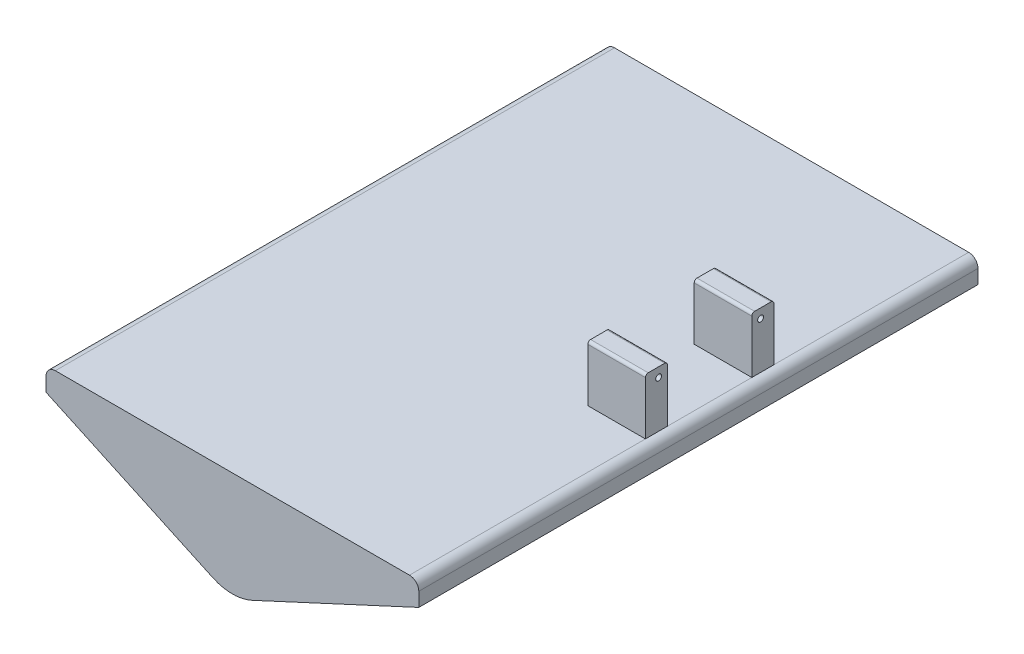
ISO-10303-21;
HEADER;
FILE_DESCRIPTION(('STEP AP214'),'2;1');
FILE_NAME('part.step','',(''),(''),'','','');
FILE_SCHEMA(('AUTOMOTIVE_DESIGN { 1 0 10303 214 1 1 1 1 }'));
ENDSEC;
DATA;
#1=APPLICATION_CONTEXT('core data for automotive mechanical design processes');
#2=APPLICATION_PROTOCOL_DEFINITION('international standard','automotive_design',2000,#1);
#3=PRODUCT_CONTEXT('',#1,'mechanical');
#4=PRODUCT('Part','Part','',(#3));
#5=PRODUCT_RELATED_PRODUCT_CATEGORY('part','',(#4));
#6=PRODUCT_DEFINITION_FORMATION('','',#4);
#7=PRODUCT_DEFINITION_CONTEXT('part definition',#1,'design');
#8=PRODUCT_DEFINITION('design','',#6,#7);
#9=PRODUCT_DEFINITION_SHAPE('','',#8);
#10=(LENGTH_UNIT() NAMED_UNIT(*) SI_UNIT(.MILLI.,.METRE.));
#11=(NAMED_UNIT(*) PLANE_ANGLE_UNIT() SI_UNIT($,.RADIAN.));
#12=(NAMED_UNIT(*) SI_UNIT($,.STERADIAN.) SOLID_ANGLE_UNIT());
#13=UNCERTAINTY_MEASURE_WITH_UNIT(LENGTH_MEASURE(1.E-05),#10,'distance_accuracy_value','');
#14=(GEOMETRIC_REPRESENTATION_CONTEXT(3) GLOBAL_UNCERTAINTY_ASSIGNED_CONTEXT((#13)) GLOBAL_UNIT_ASSIGNED_CONTEXT((#10,
#11,#12)) REPRESENTATION_CONTEXT('',''));
#15=CARTESIAN_POINT('',(0.,0.,0.));
#16=DIRECTION('',(0.,0.,1.));
#17=DIRECTION('',(1.,0.,0.));
#18=AXIS2_PLACEMENT_3D('',#15,#16,#17);
#19=CARTESIAN_POINT('',(0.,3.175,152.4));
#20=DIRECTION('',(0.,1.,0.));
#21=DIRECTION('',(0.,0.,1.));
#22=AXIS2_PLACEMENT_3D('',#19,#20,#21);
#23=PLANE('',#22);
#24=DIRECTION('',(0.,0.,1.));
#25=VECTOR('',#24,1.);
#26=CARTESIAN_POINT('',(32.5600000000001,3.175,53.1));
#27=LINE('',#26,#25);
#28=CARTESIAN_POINT('',(32.5600000000001,3.175,53.1));
#29=VERTEX_POINT('',#28);
#30=CARTESIAN_POINT('',(32.5600000000001,3.175,59.1));
#31=VERTEX_POINT('',#30);
#32=EDGE_CURVE('E233',#29,#31,#27,.T.);
#33=ORIENTED_EDGE('',*,*,#32,.F.);
#34=DIRECTION('',(-1.,0.,0.));
#35=VECTOR('',#34,1.);
#36=CARTESIAN_POINT('',(48.2600000000001,3.175,53.1));
#37=LINE('',#36,#35);
#38=CARTESIAN_POINT('',(48.2600000000001,3.175,53.1));
#39=VERTEX_POINT('',#38);
#40=EDGE_CURVE('E206',#39,#29,#37,.T.);
#41=ORIENTED_EDGE('',*,*,#40,.F.);
#42=DIRECTION('',(0.,0.,-1.));
#43=VECTOR('',#42,1.);
#44=CARTESIAN_POINT('',(48.2600000000001,3.175,152.4));
#45=LINE('',#44,#43);
#46=CARTESIAN_POINT('',(48.2600000000001,3.175,0.));
#47=VERTEX_POINT('',#46);
#48=EDGE_CURVE('E215',#39,#47,#45,.T.);
#49=ORIENTED_EDGE('',*,*,#48,.T.);
#50=DIRECTION('',(1.,0.,0.));
#51=VECTOR('',#50,1.);
#52=CARTESIAN_POINT('',(0.,3.175,0.));
#53=LINE('',#52,#51);
#54=CARTESIAN_POINT('',(-48.2599999999999,3.175,0.));
#55=VERTEX_POINT('',#54);
#56=EDGE_CURVE('E337',#55,#47,#53,.T.);
#57=ORIENTED_EDGE('',*,*,#56,.F.);
#58=DIRECTION('',(0.,0.,-1.));
#59=VECTOR('',#58,1.);
#60=CARTESIAN_POINT('',(-48.2599999999999,3.175,152.4));
#61=LINE('',#60,#59);
#62=CARTESIAN_POINT('',(-48.2599999999999,3.175,152.4));
#63=VERTEX_POINT('',#62);
#64=EDGE_CURVE('E365',#55,#63,#61,.F.);
#65=ORIENTED_EDGE('',*,*,#64,.T.);
#66=DIRECTION('',(1.,0.,0.));
#67=VECTOR('',#66,1.);
#68=CARTESIAN_POINT('',(0.,3.175,152.4));
#69=LINE('',#68,#67);
#70=CARTESIAN_POINT('',(48.2600000000001,3.175,152.4));
#71=VERTEX_POINT('',#70);
#72=EDGE_CURVE('E321',#63,#71,#69,.T.);
#73=ORIENTED_EDGE('',*,*,#72,.T.);
#74=CARTESIAN_POINT('',(48.2600000000001,3.175,88.1));
#75=VERTEX_POINT('',#74);
#76=EDGE_CURVE('E229',#71,#75,#45,.T.);
#77=ORIENTED_EDGE('',*,*,#76,.T.);
#78=DIRECTION('',(1.,0.,0.));
#79=VECTOR('',#78,1.);
#80=CARTESIAN_POINT('',(48.2600000000001,3.175,88.1));
#81=LINE('',#80,#79);
#82=CARTESIAN_POINT('',(32.5600000000001,3.175,88.1));
#83=VERTEX_POINT('',#82);
#84=EDGE_CURVE('E255',#83,#75,#81,.T.);
#85=ORIENTED_EDGE('',*,*,#84,.F.);
#86=DIRECTION('',(0.,0.,1.));
#87=VECTOR('',#86,1.);
#88=CARTESIAN_POINT('',(32.5600000000001,3.175,82.1));
#89=LINE('',#88,#87);
#90=CARTESIAN_POINT('',(32.5600000000001,3.175,82.1));
#91=VERTEX_POINT('',#90);
#92=EDGE_CURVE('E261',#91,#83,#89,.T.);
#93=ORIENTED_EDGE('',*,*,#92,.F.);
#94=DIRECTION('',(-1.,0.,0.));
#95=VECTOR('',#94,1.);
#96=CARTESIAN_POINT('',(48.2600000000001,3.175,82.1));
#97=LINE('',#96,#95);
#98=CARTESIAN_POINT('',(48.2600000000001,3.175,82.1));
#99=VERTEX_POINT('',#98);
#100=EDGE_CURVE('E240',#99,#91,#97,.T.);
#101=ORIENTED_EDGE('',*,*,#100,.F.);
#102=CARTESIAN_POINT('',(48.2600000000001,3.175,59.1));
#103=VERTEX_POINT('',#102);
#104=EDGE_CURVE('E226',#99,#103,#45,.T.);
#105=ORIENTED_EDGE('',*,*,#104,.T.);
#106=DIRECTION('',(1.,0.,0.));
#107=VECTOR('',#106,1.);
#108=CARTESIAN_POINT('',(48.2600000000001,3.175,59.1));
#109=LINE('',#108,#107);
#110=EDGE_CURVE('E250',#31,#103,#109,.T.);
#111=ORIENTED_EDGE('',*,*,#110,.F.);
#112=EDGE_LOOP('',(#33,#41,#49,#57,#65,#73,#77,#85,#93,#101,#105,#111));
#113=FACE_BOUND('',#112,.T.);
#114=ADVANCED_FACE('F43',(#113),#23,.T.);
#115=CARTESIAN_POINT('',(-10.1779518832667,-21.9828280773283,152.4));
#116=DIRECTION('',(0.420147930242184,0.907455627958309,0.));
#117=DIRECTION('',(-0.907455627958309,0.420147930242184,0.));
#118=AXIS2_PLACEMENT_3D('',#115,#116,#117);
#119=PLANE('',#118);
#120=DIRECTION('',(0.,0.,-1.));
#121=VECTOR('',#120,1.);
#122=CARTESIAN_POINT('',(-5.33587871407572,-24.2246864750705,152.4));
#123=LINE('',#122,#121);
#124=CARTESIAN_POINT('',(-5.33587871407572,-24.2246864750705,57.15));
#125=VERTEX_POINT('',#124);
#126=CARTESIAN_POINT('',(-5.33587871407572,-24.2246864750705,0.));
#127=VERTEX_POINT('',#126);
#128=EDGE_CURVE('E351',#125,#127,#123,.T.);
#129=ORIENTED_EDGE('',*,*,#128,.F.);
#130=DIRECTION('',(-0.907455627958309,0.420147930242184,0.));
#131=VECTOR('',#130,1.);
#132=CARTESIAN_POINT('',(-10.1779518832667,-21.9828280773283,57.15));
#133=LINE('',#132,#131);
#134=CARTESIAN_POINT('',(-50.7999999999999,-3.175,57.15));
#135=VERTEX_POINT('',#134);
#136=EDGE_CURVE('E300',#125,#135,#133,.T.);
#137=ORIENTED_EDGE('',*,*,#136,.T.);
#138=DIRECTION('',(0.,0.,-1.));
#139=VECTOR('',#138,1.);
#140=CARTESIAN_POINT('',(-50.7999999999999,-3.17499999999999,152.4));
#141=LINE('',#140,#139);
#142=CARTESIAN_POINT('',(-50.7999999999999,-3.17499999999999,0.));
#143=VERTEX_POINT('',#142);
#144=EDGE_CURVE('E326',#135,#143,#141,.T.);
#145=ORIENTED_EDGE('',*,*,#144,.T.);
#146=DIRECTION('',(0.907455627958309,-0.420147930242184,0.));
#147=VECTOR('',#146,1.);
#148=CARTESIAN_POINT('',(-10.1779518832667,-21.9828280773283,0.));
#149=LINE('',#148,#147);
#150=EDGE_CURVE('E307',#143,#127,#149,.T.);
#151=ORIENTED_EDGE('',*,*,#150,.T.);
#152=EDGE_LOOP('',(#129,#137,#145,#151));
#153=FACE_BOUND('',#152,.T.);
#154=ADVANCED_FACE('F467',(#153),#119,.F.);
#155=CARTESIAN_POINT('',(0.,-12.7,152.4));
#156=DIRECTION('',(0.,0.,-1.));
#157=DIRECTION('',(-1.,0.,0.));
#158=AXIS2_PLACEMENT_3D('',#155,#156,#157);
#159=CYLINDRICAL_SURFACE('',#158,12.7);
#160=CARTESIAN_POINT('',(-5.33587871407572,-24.2246864750705,152.4));
#161=VERTEX_POINT('',#160);
#162=CARTESIAN_POINT('',(-5.33587871407572,-24.2246864750705,95.25));
#163=VERTEX_POINT('',#162);
#164=EDGE_CURVE('E352',#161,#163,#123,.T.);
#165=ORIENTED_EDGE('',*,*,#164,.T.);
#166=CARTESIAN_POINT('',(0.,-12.7,95.25));
#167=DIRECTION('',(0.,0.,1.));
#168=DIRECTION('',(1.,0.,0.));
#169=AXIS2_PLACEMENT_3D('',#166,#167,#168);
#170=CIRCLE('',#169,12.7);
#171=CARTESIAN_POINT('',(5.33587871407572,-24.2246864750705,95.25));
#172=VERTEX_POINT('',#171);
#173=EDGE_CURVE('E289',#163,#172,#170,.T.);
#174=ORIENTED_EDGE('',*,*,#173,.T.);
#175=DIRECTION('',(0.,0.,-1.));
#176=VECTOR('',#175,1.);
#177=CARTESIAN_POINT('',(5.33587871407572,-24.2246864750705,152.4));
#178=LINE('',#177,#176);
#179=CARTESIAN_POINT('',(5.33587871407572,-24.2246864750705,152.4));
#180=VERTEX_POINT('',#179);
#181=EDGE_CURVE('E348',#180,#172,#178,.T.);
#182=ORIENTED_EDGE('',*,*,#181,.F.);
#183=CARTESIAN_POINT('',(0.,-12.7,152.4));
#184=DIRECTION('',(0.,0.,1.));
#185=DIRECTION('',(1.,0.,0.));
#186=AXIS2_PLACEMENT_3D('',#183,#184,#185);
#187=CIRCLE('',#186,12.7);
#188=EDGE_CURVE('E313',#161,#180,#187,.T.);
#189=ORIENTED_EDGE('',*,*,#188,.F.);
#190=EDGE_LOOP('',(#165,#174,#182,#189));
#191=FACE_BOUND('',#190,.T.);
#192=ADVANCED_FACE('F474',(#191),#159,.T.);
#193=CARTESIAN_POINT('',(10.1779518832667,-21.9828280773283,152.4));
#194=DIRECTION('',(0.420147930242182,-0.90745562795831,0.));
#195=DIRECTION('',(0.90745562795831,0.420147930242183,0.));
#196=AXIS2_PLACEMENT_3D('',#193,#194,#195);
#197=PLANE('',#196);
#198=DIRECTION('',(0.90745562795831,0.420147930242183,0.));
#199=VECTOR('',#198,1.);
#200=CARTESIAN_POINT('',(10.1779518832667,-21.9828280773283,57.15));
#201=LINE('',#200,#199);
#202=CARTESIAN_POINT('',(5.33587871407572,-24.2246864750705,57.15));
#203=VERTEX_POINT('',#202);
#204=CARTESIAN_POINT('',(50.7999999999999,-3.175,57.15));
#205=VERTEX_POINT('',#204);
#206=EDGE_CURVE('E295',#203,#205,#201,.T.);
#207=ORIENTED_EDGE('',*,*,#206,.F.);
#208=CARTESIAN_POINT('',(5.33587871407572,-24.2246864750705,0.));
#209=VERTEX_POINT('',#208);
#210=EDGE_CURVE('E347',#203,#209,#178,.T.);
#211=ORIENTED_EDGE('',*,*,#210,.T.);
#212=DIRECTION('',(-0.90745562795831,-0.420147930242182,0.));
#213=VECTOR('',#212,1.);
#214=CARTESIAN_POINT('',(10.1779518832667,-21.9828280773283,0.));
#215=LINE('',#214,#213);
#216=CARTESIAN_POINT('',(50.8000000000001,-3.175,0.));
#217=VERTEX_POINT('',#216);
#218=EDGE_CURVE('E332',#217,#209,#215,.T.);
#219=ORIENTED_EDGE('',*,*,#218,.F.);
#220=DIRECTION('',(0.,0.,-1.));
#221=VECTOR('',#220,1.);
#222=CARTESIAN_POINT('',(50.8000000000001,-3.175,152.4));
#223=LINE('',#222,#221);
#224=EDGE_CURVE('E343',#205,#217,#223,.T.);
#225=ORIENTED_EDGE('',*,*,#224,.F.);
#226=EDGE_LOOP('',(#207,#211,#219,#225));
#227=FACE_BOUND('',#226,.T.);
#228=ADVANCED_FACE('F491',(#227),#197,.T.);
#229=CARTESIAN_POINT('',(0.,-12.7,0.));
#230=DIRECTION('',(0.,0.,1.));
#231=DIRECTION('',(1.,0.,0.));
#232=AXIS2_PLACEMENT_3D('',#229,#230,#231);
#233=CYLINDRICAL_SURFACE('',#232,6.985);
#234=CARTESIAN_POINT('',(0.,-12.7,57.15));
#235=DIRECTION('',(0.,0.,-1.));
#236=DIRECTION('',(-1.,0.,0.));
#237=AXIS2_PLACEMENT_3D('',#234,#235,#236);
#238=CIRCLE('',#237,6.985);
#239=CARTESIAN_POINT('',(-6.985,-12.7,57.15));
#240=VERTEX_POINT('',#239);
#241=EDGE_CURVE('E294',#240,#240,#238,.F.);
#242=ORIENTED_EDGE('',*,*,#241,.T.);
#243=EDGE_LOOP('',(#242));
#244=FACE_BOUND('',#243,.T.);
#245=CARTESIAN_POINT('',(0.,-12.7,0.));
#246=DIRECTION('',(0.,0.,1.));
#247=DIRECTION('',(1.,0.,0.));
#248=AXIS2_PLACEMENT_3D('',#245,#246,#247);
#249=CIRCLE('',#248,6.985);
#250=CARTESIAN_POINT('',(6.985,-12.7,0.));
#251=VERTEX_POINT('',#250);
#252=EDGE_CURVE('E304',#251,#251,#249,.T.);
#253=ORIENTED_EDGE('',*,*,#252,.F.);
#254=EDGE_LOOP('',(#253));
#255=FACE_BOUND('',#254,.T.);
#256=ADVANCED_FACE('F496',(#244,#255),#233,.F.);
#257=CARTESIAN_POINT('',(-50.7999999999999,-3.17499999999999,152.4));
#258=VERTEX_POINT('',#257);
#259=CARTESIAN_POINT('',(-50.7999999999999,-3.17499999999999,95.25));
#260=VERTEX_POINT('',#259);
#261=EDGE_CURVE('E340',#258,#260,#141,.T.);
#262=ORIENTED_EDGE('',*,*,#261,.T.);
#263=DIRECTION('',(0.907455627958309,-0.420147930242184,0.));
#264=VECTOR('',#263,1.);
#265=CARTESIAN_POINT('',(-10.1779518832667,-21.9828280773283,95.25));
#266=LINE('',#265,#264);
#267=EDGE_CURVE('E291',#260,#163,#266,.T.);
#268=ORIENTED_EDGE('',*,*,#267,.T.);
#269=ORIENTED_EDGE('',*,*,#164,.F.);
#270=DIRECTION('',(0.907455627958309,-0.420147930242184,0.));
#271=VECTOR('',#270,1.);
#272=CARTESIAN_POINT('',(-10.1779518832667,-21.9828280773283,152.4));
#273=LINE('',#272,#271);
#274=EDGE_CURVE('E310',#258,#161,#273,.T.);
#275=ORIENTED_EDGE('',*,*,#274,.F.);
#276=EDGE_LOOP('',(#262,#268,#269,#275));
#277=FACE_BOUND('',#276,.T.);
#278=ADVANCED_FACE('F477',(#277),#119,.F.);
#279=ORIENTED_EDGE('',*,*,#210,.F.);
#280=CARTESIAN_POINT('',(0.,-12.7,57.15));
#281=DIRECTION('',(0.,0.,-1.));
#282=DIRECTION('',(-1.,0.,0.));
#283=AXIS2_PLACEMENT_3D('',#280,#281,#282);
#284=CIRCLE('',#283,12.7);
#285=EDGE_CURVE('E297',#203,#125,#284,.T.);
#286=ORIENTED_EDGE('',*,*,#285,.T.);
#287=ORIENTED_EDGE('',*,*,#128,.T.);
#288=CARTESIAN_POINT('',(0.,-12.7,0.));
#289=DIRECTION('',(0.,0.,1.));
#290=DIRECTION('',(1.,0.,0.));
#291=AXIS2_PLACEMENT_3D('',#288,#289,#290);
#292=CIRCLE('',#291,12.7);
#293=EDGE_CURVE('E329',#127,#209,#292,.T.);
#294=ORIENTED_EDGE('',*,*,#293,.T.);
#295=EDGE_LOOP('',(#279,#286,#287,#294));
#296=FACE_BOUND('',#295,.T.);
#297=ADVANCED_FACE('F489',(#296),#159,.T.);
#298=DIRECTION('',(-0.90745562795831,-0.420147930242183,0.));
#299=VECTOR('',#298,1.);
#300=CARTESIAN_POINT('',(10.1779518832667,-21.9828280773283,95.25));
#301=LINE('',#300,#299);
#302=CARTESIAN_POINT('',(50.7999999999999,-3.175,95.25));
#303=VERTEX_POINT('',#302);
#304=EDGE_CURVE('E286',#303,#172,#301,.T.);
#305=ORIENTED_EDGE('',*,*,#304,.F.);
#306=CARTESIAN_POINT('',(50.8000000000001,-3.175,152.4));
#307=VERTEX_POINT('',#306);
#308=EDGE_CURVE('E344',#307,#303,#223,.T.);
#309=ORIENTED_EDGE('',*,*,#308,.F.);
#310=DIRECTION('',(-0.90745562795831,-0.420147930242182,0.));
#311=VECTOR('',#310,1.);
#312=CARTESIAN_POINT('',(10.1779518832667,-21.9828280773283,152.4));
#313=LINE('',#312,#311);
#314=EDGE_CURVE('E316',#307,#180,#313,.T.);
#315=ORIENTED_EDGE('',*,*,#314,.T.);
#316=ORIENTED_EDGE('',*,*,#181,.T.);
#317=EDGE_LOOP('',(#305,#309,#315,#316));
#318=FACE_BOUND('',#317,.T.);
#319=ADVANCED_FACE('F485',(#318),#197,.T.);
#320=CARTESIAN_POINT('',(50.8000000000001,0.,152.4));
#321=DIRECTION('',(1.,0.,0.));
#322=DIRECTION('',(0.,1.,0.));
#323=AXIS2_PLACEMENT_3D('',#320,#321,#322);
#324=PLANE('',#323);
#325=DIRECTION('',(0.,-1.,0.));
#326=VECTOR('',#325,1.);
#327=CARTESIAN_POINT('',(50.8000000000001,0.,0.));
#328=LINE('',#327,#326);
#329=CARTESIAN_POINT('',(50.8000000000001,0.635000000000002,0.));
#330=VERTEX_POINT('',#329);
#331=EDGE_CURVE('E335',#330,#217,#328,.T.);
#332=ORIENTED_EDGE('',*,*,#331,.F.);
#333=DIRECTION('',(0.,0.,-1.));
#334=VECTOR('',#333,1.);
#335=CARTESIAN_POINT('',(50.8000000000001,0.635000000000002,152.4));
#336=LINE('',#335,#334);
#337=CARTESIAN_POINT('',(50.8000000000001,0.635000000000002,152.4));
#338=VERTEX_POINT('',#337);
#339=EDGE_CURVE('E371',#330,#338,#336,.F.);
#340=ORIENTED_EDGE('',*,*,#339,.T.);
#341=DIRECTION('',(0.,-1.,0.));
#342=VECTOR('',#341,1.);
#343=CARTESIAN_POINT('',(50.8000000000001,0.,152.4));
#344=LINE('',#343,#342);
#345=EDGE_CURVE('E319',#338,#307,#344,.T.);
#346=ORIENTED_EDGE('',*,*,#345,.T.);
#347=ORIENTED_EDGE('',*,*,#308,.T.);
#348=DIRECTION('',(0.,0.,-1.));
#349=VECTOR('',#348,1.);
#350=CARTESIAN_POINT('',(50.7999999999999,-3.175,57.15));
#351=LINE('',#350,#349);
#352=EDGE_CURVE('E279',#303,#205,#351,.T.);
#353=ORIENTED_EDGE('',*,*,#352,.T.);
#354=ORIENTED_EDGE('',*,*,#224,.T.);
#355=EDGE_LOOP('',(#332,#340,#346,#347,#353,#354));
#356=FACE_BOUND('',#355,.T.);
#357=ADVANCED_FACE('F482',(#356),#324,.T.);
#358=CARTESIAN_POINT('',(-50.7999999999999,0.,152.4));
#359=DIRECTION('',(1.,0.,0.));
#360=DIRECTION('',(0.,1.,0.));
#361=AXIS2_PLACEMENT_3D('',#358,#359,#360);
#362=PLANE('',#361);
#363=DIRECTION('',(0.,-1.,0.));
#364=VECTOR('',#363,1.);
#365=CARTESIAN_POINT('',(-50.7999999999999,0.,152.4));
#366=LINE('',#365,#364);
#367=CARTESIAN_POINT('',(-50.7999999999999,0.635000000000007,152.4));
#368=VERTEX_POINT('',#367);
#369=EDGE_CURVE('E324',#368,#258,#366,.T.);
#370=ORIENTED_EDGE('',*,*,#369,.F.);
#371=DIRECTION('',(0.,0.,-1.));
#372=VECTOR('',#371,1.);
#373=CARTESIAN_POINT('',(-50.7999999999999,0.635000000000007,0.));
#374=LINE('',#373,#372);
#375=CARTESIAN_POINT('',(-50.7999999999999,0.635000000000007,0.));
#376=VERTEX_POINT('',#375);
#377=EDGE_CURVE('E355',#368,#376,#374,.T.);
#378=ORIENTED_EDGE('',*,*,#377,.T.);
#379=DIRECTION('',(0.,-1.,0.));
#380=VECTOR('',#379,1.);
#381=CARTESIAN_POINT('',(-50.7999999999999,0.,0.));
#382=LINE('',#381,#380);
#383=EDGE_CURVE('E314',#376,#143,#382,.T.);
#384=ORIENTED_EDGE('',*,*,#383,.T.);
#385=ORIENTED_EDGE('',*,*,#144,.F.);
#386=DIRECTION('',(0.,0.,1.));
#387=VECTOR('',#386,1.);
#388=CARTESIAN_POINT('',(-50.7999999999999,-3.175,57.15));
#389=LINE('',#388,#387);
#390=EDGE_CURVE('E273',#135,#260,#389,.T.);
#391=ORIENTED_EDGE('',*,*,#390,.T.);
#392=ORIENTED_EDGE('',*,*,#261,.F.);
#393=EDGE_LOOP('',(#370,#378,#384,#385,#391,#392));
#394=FACE_BOUND('',#393,.T.);
#395=ADVANCED_FACE('F480',(#394),#362,.F.);
#396=CARTESIAN_POINT('',(0.,0.,152.4));
#397=DIRECTION('',(0.,0.,1.));
#398=DIRECTION('',(1.,0.,0.));
#399=AXIS2_PLACEMENT_3D('',#396,#397,#398);
#400=PLANE('',#399);
#401=ORIENTED_EDGE('',*,*,#72,.F.);
#402=CARTESIAN_POINT('',(-48.2599999999999,0.635000000000004,152.4));
#403=DIRECTION('',(0.,0.,1.));
#404=DIRECTION('',(1.,0.,0.));
#405=AXIS2_PLACEMENT_3D('',#402,#403,#404);
#406=CIRCLE('',#405,2.54);
#407=EDGE_CURVE('E369',#63,#368,#406,.T.);
#408=ORIENTED_EDGE('',*,*,#407,.T.);
#409=ORIENTED_EDGE('',*,*,#369,.T.);
#410=ORIENTED_EDGE('',*,*,#274,.T.);
#411=ORIENTED_EDGE('',*,*,#188,.T.);
#412=ORIENTED_EDGE('',*,*,#314,.F.);
#413=ORIENTED_EDGE('',*,*,#345,.F.);
#414=CARTESIAN_POINT('',(48.2600000000001,0.635000000000004,152.4));
#415=DIRECTION('',(0.,0.,1.));
#416=DIRECTION('',(1.,0.,0.));
#417=AXIS2_PLACEMENT_3D('',#414,#415,#416);
#418=CIRCLE('',#417,2.54);
#419=EDGE_CURVE('E367',#338,#71,#418,.T.);
#420=ORIENTED_EDGE('',*,*,#419,.T.);
#421=EDGE_LOOP('',(#401,#408,#409,#410,#411,#412,#413,#420));
#422=FACE_BOUND('',#421,.T.);
#423=ADVANCED_FACE('F705',(#422),#400,.T.);
#424=CARTESIAN_POINT('',(0.,0.,0.));
#425=DIRECTION('',(0.,0.,1.));
#426=DIRECTION('',(1.,0.,0.));
#427=AXIS2_PLACEMENT_3D('',#424,#425,#426);
#428=PLANE('',#427);
#429=ORIENTED_EDGE('',*,*,#252,.T.);
#430=EDGE_LOOP('',(#429));
#431=FACE_BOUND('',#430,.T.);
#432=ORIENTED_EDGE('',*,*,#383,.F.);
#433=CARTESIAN_POINT('',(-48.2599999999999,0.635000000000004,0.));
#434=DIRECTION('',(0.,0.,1.));
#435=DIRECTION('',(1.,0.,0.));
#436=AXIS2_PLACEMENT_3D('',#433,#434,#435);
#437=CIRCLE('',#436,2.54);
#438=EDGE_CURVE('E227',#376,#55,#437,.F.);
#439=ORIENTED_EDGE('',*,*,#438,.T.);
#440=ORIENTED_EDGE('',*,*,#56,.T.);
#441=CARTESIAN_POINT('',(48.2600000000001,0.635000000000004,0.));
#442=DIRECTION('',(0.,0.,1.));
#443=DIRECTION('',(1.,0.,0.));
#444=AXIS2_PLACEMENT_3D('',#441,#442,#443);
#445=CIRCLE('',#444,2.54);
#446=EDGE_CURVE('E222',#47,#330,#445,.F.);
#447=ORIENTED_EDGE('',*,*,#446,.T.);
#448=ORIENTED_EDGE('',*,*,#331,.T.);
#449=ORIENTED_EDGE('',*,*,#218,.T.);
#450=ORIENTED_EDGE('',*,*,#293,.F.);
#451=ORIENTED_EDGE('',*,*,#150,.F.);
#452=EDGE_LOOP('',(#432,#439,#440,#447,#448,#449,#450,#451));
#453=FACE_BOUND('',#452,.T.);
#454=ADVANCED_FACE('F695',(#431,#453),#428,.F.);
#455=CARTESIAN_POINT('',(-50.7999999999999,-25.4,57.15));
#456=DIRECTION('',(0.,0.,-1.));
#457=DIRECTION('',(-1.,0.,0.));
#458=AXIS2_PLACEMENT_3D('',#455,#456,#457);
#459=PLANE('',#458);
#460=ORIENTED_EDGE('',*,*,#241,.F.);
#461=EDGE_LOOP('',(#460));
#462=FACE_BOUND('',#461,.T.);
#463=ORIENTED_EDGE('',*,*,#285,.F.);
#464=ORIENTED_EDGE('',*,*,#206,.T.);
#465=DIRECTION('',(-1.,0.,0.));
#466=VECTOR('',#465,1.);
#467=CARTESIAN_POINT('',(-50.7999999999999,-3.175,57.15));
#468=LINE('',#467,#466);
#469=EDGE_CURVE('E282',#205,#135,#468,.T.);
#470=ORIENTED_EDGE('',*,*,#469,.T.);
#471=ORIENTED_EDGE('',*,*,#136,.F.);
#472=EDGE_LOOP('',(#463,#464,#470,#471));
#473=FACE_BOUND('',#472,.T.);
#474=ADVANCED_FACE('F685',(#462,#473),#459,.F.);
#475=CARTESIAN_POINT('',(-50.7999999999999,-25.4,95.25));
#476=DIRECTION('',(0.,0.,1.));
#477=DIRECTION('',(1.,0.,0.));
#478=AXIS2_PLACEMENT_3D('',#475,#476,#477);
#479=PLANE('',#478);
#480=CARTESIAN_POINT('',(0.,-12.7,95.25));
#481=DIRECTION('',(0.,0.,1.));
#482=DIRECTION('',(1.,0.,0.));
#483=AXIS2_PLACEMENT_3D('',#480,#481,#482);
#484=CIRCLE('',#483,6.985);
#485=CARTESIAN_POINT('',(6.985,-12.7,95.25));
#486=VERTEX_POINT('',#485);
#487=EDGE_CURVE('E285',#486,#486,#484,.F.);
#488=ORIENTED_EDGE('',*,*,#487,.F.);
#489=EDGE_LOOP('',(#488));
#490=FACE_BOUND('',#489,.T.);
#491=DIRECTION('',(1.,0.,0.));
#492=VECTOR('',#491,1.);
#493=CARTESIAN_POINT('',(-50.7999999999999,-3.175,95.25));
#494=LINE('',#493,#492);
#495=EDGE_CURVE('E276',#260,#303,#494,.T.);
#496=ORIENTED_EDGE('',*,*,#495,.T.);
#497=ORIENTED_EDGE('',*,*,#304,.T.);
#498=ORIENTED_EDGE('',*,*,#173,.F.);
#499=ORIENTED_EDGE('',*,*,#267,.F.);
#500=EDGE_LOOP('',(#496,#497,#498,#499));
#501=FACE_BOUND('',#500,.T.);
#502=ADVANCED_FACE('F675',(#490,#501),#479,.F.);
#503=CARTESIAN_POINT('',(0.,-3.175,0.));
#504=DIRECTION('',(0.,1.,0.));
#505=DIRECTION('',(0.,0.,1.));
#506=AXIS2_PLACEMENT_3D('',#503,#504,#505);
#507=PLANE('',#506);
#508=ORIENTED_EDGE('',*,*,#390,.F.);
#509=ORIENTED_EDGE('',*,*,#469,.F.);
#510=ORIENTED_EDGE('',*,*,#352,.F.);
#511=ORIENTED_EDGE('',*,*,#495,.F.);
#512=EDGE_LOOP('',(#508,#509,#510,#511));
#513=FACE_BOUND('',#512,.T.);
#514=ADVANCED_FACE('F665',(#513),#507,.F.);
#515=CARTESIAN_POINT('',(0.,0.,146.05));
#516=DIRECTION('',(0.,0.,1.));
#517=DIRECTION('',(1.,0.,0.));
#518=AXIS2_PLACEMENT_3D('',#515,#516,#517);
#519=PLANE('',#518);
#520=CARTESIAN_POINT('',(0.,-12.7,146.05));
#521=DIRECTION('',(0.,0.,1.));
#522=DIRECTION('',(1.,0.,0.));
#523=AXIS2_PLACEMENT_3D('',#520,#521,#522);
#524=CIRCLE('',#523,6.985);
#525=CARTESIAN_POINT('',(6.985,-12.7,146.05));
#526=VERTEX_POINT('',#525);
#527=EDGE_CURVE('E303',#526,#526,#524,.T.);
#528=ORIENTED_EDGE('',*,*,#527,.F.);
#529=EDGE_LOOP('',(#528));
#530=FACE_BOUND('',#529,.T.);
#531=ADVANCED_FACE('F653',(#530),#519,.F.);
#532=ORIENTED_EDGE('',*,*,#487,.T.);
#533=EDGE_LOOP('',(#532));
#534=FACE_BOUND('',#533,.T.);
#535=ORIENTED_EDGE('',*,*,#527,.T.);
#536=EDGE_LOOP('',(#535));
#537=FACE_BOUND('',#536,.T.);
#538=ADVANCED_FACE('F501',(#534,#537),#233,.F.);
#539=CARTESIAN_POINT('',(-48.2599999999999,0.635000000000004,152.4));
#540=DIRECTION('',(0.,0.,1.));
#541=DIRECTION('',(1.,0.,0.));
#542=AXIS2_PLACEMENT_3D('',#539,#540,#541);
#543=CYLINDRICAL_SURFACE('',#542,2.54);
#544=ORIENTED_EDGE('',*,*,#407,.F.);
#545=ORIENTED_EDGE('',*,*,#64,.F.);
#546=ORIENTED_EDGE('',*,*,#438,.F.);
#547=ORIENTED_EDGE('',*,*,#377,.F.);
#548=EDGE_LOOP('',(#544,#545,#546,#547));
#549=FACE_BOUND('',#548,.T.);
#550=ADVANCED_FACE('F498',(#549),#543,.T.);
#551=CARTESIAN_POINT('',(48.2600000000001,0.635000000000004,152.4));
#552=DIRECTION('',(0.,0.,-1.));
#553=DIRECTION('',(-1.,0.,0.));
#554=AXIS2_PLACEMENT_3D('',#551,#552,#553);
#555=CYLINDRICAL_SURFACE('',#554,2.54);
#556=ORIENTED_EDGE('',*,*,#419,.F.);
#557=ORIENTED_EDGE('',*,*,#339,.F.);
#558=ORIENTED_EDGE('',*,*,#446,.F.);
#559=ORIENTED_EDGE('',*,*,#48,.F.);
#560=DIRECTION('',(0.,0.,-1.));
#561=VECTOR('',#560,1.);
#562=CARTESIAN_POINT('',(48.2600000000001,3.175,53.1));
#563=LINE('',#562,#561);
#564=EDGE_CURVE('E219',#103,#39,#563,.T.);
#565=ORIENTED_EDGE('',*,*,#564,.F.);
#566=ORIENTED_EDGE('',*,*,#104,.F.);
#567=DIRECTION('',(0.,0.,-1.));
#568=VECTOR('',#567,1.);
#569=CARTESIAN_POINT('',(48.2600000000001,3.175,82.1));
#570=LINE('',#569,#568);
#571=EDGE_CURVE('E237',#75,#99,#570,.T.);
#572=ORIENTED_EDGE('',*,*,#571,.F.);
#573=ORIENTED_EDGE('',*,*,#76,.F.);
#574=EDGE_LOOP('',(#556,#557,#558,#559,#565,#566,#572,#573));
#575=FACE_BOUND('',#574,.T.);
#576=ADVANCED_FACE('F217',(#575),#555,.T.);
#577=CARTESIAN_POINT('',(48.2600000000001,18.415,82.1));
#578=DIRECTION('',(-1.,0.,0.));
#579=DIRECTION('',(0.,0.,1.));
#580=AXIS2_PLACEMENT_3D('',#577,#578,#579);
#581=PLANE('',#580);
#582=CARTESIAN_POINT('',(48.2600000000001,15.875,84.495000084));
#583=DIRECTION('',(-1.,0.,0.));
#584=DIRECTION('',(0.,0.,1.));
#585=AXIS2_PLACEMENT_3D('',#582,#583,#584);
#586=CIRCLE('',#585,0.799999999999995);
#587=CARTESIAN_POINT('',(48.2600000000001,15.875,85.295000084));
#588=VERTEX_POINT('',#587);
#589=EDGE_CURVE('E210',#588,#588,#586,.T.);
#590=ORIENTED_EDGE('',*,*,#589,.T.);
#591=EDGE_LOOP('',(#590));
#592=FACE_BOUND('',#591,.T.);
#593=DIRECTION('',(0.,0.,-1.));
#594=VECTOR('',#593,1.);
#595=CARTESIAN_POINT('',(48.2600000000001,18.415,82.1));
#596=LINE('',#595,#594);
#597=CARTESIAN_POINT('',(48.2600000000001,18.415,87.338));
#598=VERTEX_POINT('',#597);
#599=CARTESIAN_POINT('',(48.2600000000001,18.415,82.862));
#600=VERTEX_POINT('',#599);
#601=EDGE_CURVE('E251',#598,#600,#596,.T.);
#602=ORIENTED_EDGE('',*,*,#601,.F.);
#603=CARTESIAN_POINT('',(48.2600000000001,17.653,87.338));
#604=DIRECTION('',(-1.,0.,0.));
#605=DIRECTION('',(0.,0.,1.));
#606=AXIS2_PLACEMENT_3D('',#603,#604,#605);
#607=CIRCLE('',#606,0.762);
#608=CARTESIAN_POINT('',(48.2600000000001,17.653,88.1));
#609=VERTEX_POINT('',#608);
#610=EDGE_CURVE('E381',#598,#609,#607,.F.);
#611=ORIENTED_EDGE('',*,*,#610,.T.);
#612=DIRECTION('',(0.,-1.,0.));
#613=VECTOR('',#612,1.);
#614=CARTESIAN_POINT('',(48.2600000000001,18.415,88.1));
#615=LINE('',#614,#613);
#616=EDGE_CURVE('E257',#609,#75,#615,.T.);
#617=ORIENTED_EDGE('',*,*,#616,.T.);
#618=ORIENTED_EDGE('',*,*,#571,.T.);
#619=DIRECTION('',(0.,-1.,0.));
#620=VECTOR('',#619,1.);
#621=CARTESIAN_POINT('',(48.2600000000001,18.415,82.1));
#622=LINE('',#621,#620);
#623=CARTESIAN_POINT('',(48.2600000000001,17.653,82.1));
#624=VERTEX_POINT('',#623);
#625=EDGE_CURVE('E271',#624,#99,#622,.T.);
#626=ORIENTED_EDGE('',*,*,#625,.F.);
#627=CARTESIAN_POINT('',(48.2600000000001,17.653,82.862));
#628=DIRECTION('',(-1.,0.,0.));
#629=DIRECTION('',(0.,0.,1.));
#630=AXIS2_PLACEMENT_3D('',#627,#628,#629);
#631=CIRCLE('',#630,0.762);
#632=EDGE_CURVE('E379',#624,#600,#631,.F.);
#633=ORIENTED_EDGE('',*,*,#632,.T.);
#634=EDGE_LOOP('',(#602,#611,#617,#618,#626,#633));
#635=FACE_BOUND('',#634,.T.);
#636=ADVANCED_FACE('F448',(#592,#635),#581,.F.);
#637=CARTESIAN_POINT('',(48.2600000000001,18.415,82.1));
#638=DIRECTION('',(0.,0.,1.));
#639=DIRECTION('',(1.,0.,0.));
#640=AXIS2_PLACEMENT_3D('',#637,#638,#639);
#641=PLANE('',#640);
#642=DIRECTION('',(0.,-1.,0.));
#643=VECTOR('',#642,1.);
#644=CARTESIAN_POINT('',(32.5600000000001,18.415,82.1));
#645=LINE('',#644,#643);
#646=CARTESIAN_POINT('',(32.5600000000001,17.653,82.1));
#647=VERTEX_POINT('',#646);
#648=EDGE_CURVE('E269',#647,#91,#645,.T.);
#649=ORIENTED_EDGE('',*,*,#648,.F.);
#650=DIRECTION('',(-1.,0.,0.));
#651=VECTOR('',#650,1.);
#652=CARTESIAN_POINT('',(48.2600000000001,17.653,82.1));
#653=LINE('',#652,#651);
#654=EDGE_CURVE('E389',#647,#624,#653,.F.);
#655=ORIENTED_EDGE('',*,*,#654,.T.);
#656=ORIENTED_EDGE('',*,*,#625,.T.);
#657=ORIENTED_EDGE('',*,*,#100,.T.);
#658=EDGE_LOOP('',(#649,#655,#656,#657));
#659=FACE_BOUND('',#658,.T.);
#660=ADVANCED_FACE('F455',(#659),#641,.F.);
#661=CARTESIAN_POINT('',(32.5600000000001,18.415,82.1));
#662=DIRECTION('',(1.,0.,0.));
#663=DIRECTION('',(0.,0.,-1.));
#664=AXIS2_PLACEMENT_3D('',#661,#662,#663);
#665=PLANE('',#664);
#666=CARTESIAN_POINT('',(32.5600000000002,15.875,84.495000084));
#667=DIRECTION('',(-1.,0.,0.));
#668=DIRECTION('',(0.,0.,1.));
#669=AXIS2_PLACEMENT_3D('',#666,#667,#668);
#670=CIRCLE('',#669,0.799999999999995);
#671=CARTESIAN_POINT('',(32.5600000000002,15.875,85.295000084));
#672=VERTEX_POINT('',#671);
#673=EDGE_CURVE('E961',#672,#672,#670,.T.);
#674=ORIENTED_EDGE('',*,*,#673,.F.);
#675=EDGE_LOOP('',(#674));
#676=FACE_BOUND('',#675,.T.);
#677=DIRECTION('',(0.,-1.,0.));
#678=VECTOR('',#677,1.);
#679=CARTESIAN_POINT('',(32.5600000000001,18.415,88.1));
#680=LINE('',#679,#678);
#681=CARTESIAN_POINT('',(32.5600000000001,17.653,88.1));
#682=VERTEX_POINT('',#681);
#683=EDGE_CURVE('E267',#682,#83,#680,.T.);
#684=ORIENTED_EDGE('',*,*,#683,.F.);
#685=CARTESIAN_POINT('',(32.5600000000001,17.653,87.338));
#686=DIRECTION('',(1.,0.,0.));
#687=DIRECTION('',(0.,0.,-1.));
#688=AXIS2_PLACEMENT_3D('',#685,#686,#687);
#689=CIRCLE('',#688,0.762);
#690=CARTESIAN_POINT('',(32.5600000000001,18.415,87.338));
#691=VERTEX_POINT('',#690);
#692=EDGE_CURVE('E387',#682,#691,#689,.F.);
#693=ORIENTED_EDGE('',*,*,#692,.T.);
#694=DIRECTION('',(0.,0.,1.));
#695=VECTOR('',#694,1.);
#696=CARTESIAN_POINT('',(32.5600000000001,18.415,82.1));
#697=LINE('',#696,#695);
#698=CARTESIAN_POINT('',(32.5600000000001,18.415,82.862));
#699=VERTEX_POINT('',#698);
#700=EDGE_CURVE('E254',#699,#691,#697,.T.);
#701=ORIENTED_EDGE('',*,*,#700,.F.);
#702=CARTESIAN_POINT('',(32.5600000000001,17.653,82.862));
#703=DIRECTION('',(1.,0.,0.));
#704=DIRECTION('',(0.,0.,-1.));
#705=AXIS2_PLACEMENT_3D('',#702,#703,#704);
#706=CIRCLE('',#705,0.762);
#707=EDGE_CURVE('E385',#699,#647,#706,.F.);
#708=ORIENTED_EDGE('',*,*,#707,.T.);
#709=ORIENTED_EDGE('',*,*,#648,.T.);
#710=ORIENTED_EDGE('',*,*,#92,.T.);
#711=EDGE_LOOP('',(#684,#693,#701,#708,#709,#710));
#712=FACE_BOUND('',#711,.T.);
#713=ADVANCED_FACE('F439',(#676,#712),#665,.F.);
#714=CARTESIAN_POINT('',(48.2600000000001,18.415,88.1));
#715=DIRECTION('',(0.,0.,-1.));
#716=DIRECTION('',(-1.,0.,0.));
#717=AXIS2_PLACEMENT_3D('',#714,#715,#716);
#718=PLANE('',#717);
#719=ORIENTED_EDGE('',*,*,#616,.F.);
#720=DIRECTION('',(1.,0.,0.));
#721=VECTOR('',#720,1.);
#722=CARTESIAN_POINT('',(48.2600000000001,17.653,88.1));
#723=LINE('',#722,#721);
#724=EDGE_CURVE('E383',#609,#682,#723,.F.);
#725=ORIENTED_EDGE('',*,*,#724,.T.);
#726=ORIENTED_EDGE('',*,*,#683,.T.);
#727=ORIENTED_EDGE('',*,*,#84,.T.);
#728=EDGE_LOOP('',(#719,#725,#726,#727));
#729=FACE_BOUND('',#728,.T.);
#730=ADVANCED_FACE('F434',(#729),#718,.F.);
#731=CARTESIAN_POINT('',(0.,18.415,0.));
#732=DIRECTION('',(0.,-1.,0.));
#733=DIRECTION('',(0.,0.,-1.));
#734=AXIS2_PLACEMENT_3D('',#731,#732,#733);
#735=PLANE('',#734);
#736=ORIENTED_EDGE('',*,*,#700,.T.);
#737=DIRECTION('',(1.,0.,0.));
#738=VECTOR('',#737,1.);
#739=CARTESIAN_POINT('',(0.,18.415,87.338));
#740=LINE('',#739,#738);
#741=EDGE_CURVE('E376',#691,#598,#740,.T.);
#742=ORIENTED_EDGE('',*,*,#741,.T.);
#743=ORIENTED_EDGE('',*,*,#601,.T.);
#744=DIRECTION('',(-1.,0.,0.));
#745=VECTOR('',#744,1.);
#746=CARTESIAN_POINT('',(0.,18.415,82.862));
#747=LINE('',#746,#745);
#748=EDGE_CURVE('E373',#600,#699,#747,.T.);
#749=ORIENTED_EDGE('',*,*,#748,.T.);
#750=EDGE_LOOP('',(#736,#742,#743,#749));
#751=FACE_BOUND('',#750,.T.);
#752=ADVANCED_FACE('F446',(#751),#735,.F.);
#753=CARTESIAN_POINT('',(48.2600000000001,18.415,53.1));
#754=DIRECTION('',(-1.,0.,0.));
#755=DIRECTION('',(0.,0.,1.));
#756=AXIS2_PLACEMENT_3D('',#753,#754,#755);
#757=PLANE('',#756);
#758=CARTESIAN_POINT('',(48.2600000000001,15.875,56.704999916));
#759=DIRECTION('',(-1.,0.,0.));
#760=DIRECTION('',(0.,0.,1.));
#761=AXIS2_PLACEMENT_3D('',#758,#759,#760);
#762=CIRCLE('',#761,0.799999999999995);
#763=CARTESIAN_POINT('',(48.2600000000001,15.875,57.504999916));
#764=VERTEX_POINT('',#763);
#765=EDGE_CURVE('E955',#764,#764,#762,.F.);
#766=ORIENTED_EDGE('',*,*,#765,.F.);
#767=EDGE_LOOP('',(#766));
#768=FACE_BOUND('',#767,.T.);
#769=DIRECTION('',(0.,-1.,0.));
#770=VECTOR('',#769,1.);
#771=CARTESIAN_POINT('',(48.2600000000001,18.415,53.1));
#772=LINE('',#771,#770);
#773=CARTESIAN_POINT('',(48.2600000000001,17.653,53.1));
#774=VERTEX_POINT('',#773);
#775=EDGE_CURVE('E202',#774,#39,#772,.T.);
#776=ORIENTED_EDGE('',*,*,#775,.F.);
#777=CARTESIAN_POINT('',(48.2600000000001,17.653,53.862));
#778=DIRECTION('',(-1.,0.,0.));
#779=DIRECTION('',(0.,0.,1.));
#780=AXIS2_PLACEMENT_3D('',#777,#778,#779);
#781=CIRCLE('',#780,0.762);
#782=CARTESIAN_POINT('',(48.2600000000001,18.415,53.862));
#783=VERTEX_POINT('',#782);
#784=EDGE_CURVE('E51',#774,#783,#781,.F.);
#785=ORIENTED_EDGE('',*,*,#784,.T.);
#786=DIRECTION('',(0.,0.,-1.));
#787=VECTOR('',#786,1.);
#788=CARTESIAN_POINT('',(48.2600000000001,18.415,53.1));
#789=LINE('',#788,#787);
#790=CARTESIAN_POINT('',(48.2600000000001,18.415,58.338));
#791=VERTEX_POINT('',#790);
#792=EDGE_CURVE('E247',#791,#783,#789,.T.);
#793=ORIENTED_EDGE('',*,*,#792,.F.);
#794=CARTESIAN_POINT('',(48.2600000000001,17.653,58.338));
#795=DIRECTION('',(-1.,0.,0.));
#796=DIRECTION('',(0.,0.,1.));
#797=AXIS2_PLACEMENT_3D('',#794,#795,#796);
#798=CIRCLE('',#797,0.762);
#799=CARTESIAN_POINT('',(48.2600000000001,17.653,59.1));
#800=VERTEX_POINT('',#799);
#801=EDGE_CURVE('E58',#791,#800,#798,.F.);
#802=ORIENTED_EDGE('',*,*,#801,.T.);
#803=DIRECTION('',(0.,-1.,0.));
#804=VECTOR('',#803,1.);
#805=CARTESIAN_POINT('',(48.2600000000001,18.415,59.1));
#806=LINE('',#805,#804);
#807=EDGE_CURVE('E236',#800,#103,#806,.T.);
#808=ORIENTED_EDGE('',*,*,#807,.T.);
#809=ORIENTED_EDGE('',*,*,#564,.T.);
#810=EDGE_LOOP('',(#776,#785,#793,#802,#808,#809));
#811=FACE_BOUND('',#810,.T.);
#812=ADVANCED_FACE('F235',(#768,#811),#757,.F.);
#813=CARTESIAN_POINT('',(48.2600000000001,18.415,53.1));
#814=DIRECTION('',(0.,0.,1.));
#815=DIRECTION('',(1.,0.,0.));
#816=AXIS2_PLACEMENT_3D('',#813,#814,#815);
#817=PLANE('',#816);
#818=DIRECTION('',(0.,-1.,0.));
#819=VECTOR('',#818,1.);
#820=CARTESIAN_POINT('',(32.5600000000001,18.415,53.1));
#821=LINE('',#820,#819);
#822=CARTESIAN_POINT('',(32.5600000000001,17.653,53.1));
#823=VERTEX_POINT('',#822);
#824=EDGE_CURVE('E209',#823,#29,#821,.T.);
#825=ORIENTED_EDGE('',*,*,#824,.F.);
#826=DIRECTION('',(-1.,0.,0.));
#827=VECTOR('',#826,1.);
#828=CARTESIAN_POINT('',(48.2600000000001,17.653,53.1));
#829=LINE('',#828,#827);
#830=EDGE_CURVE('E66',#823,#774,#829,.F.);
#831=ORIENTED_EDGE('',*,*,#830,.T.);
#832=ORIENTED_EDGE('',*,*,#775,.T.);
#833=ORIENTED_EDGE('',*,*,#40,.T.);
#834=EDGE_LOOP('',(#825,#831,#832,#833));
#835=FACE_BOUND('',#834,.T.);
#836=ADVANCED_FACE('F204',(#835),#817,.F.);
#837=CARTESIAN_POINT('',(32.5600000000001,18.415,53.1));
#838=DIRECTION('',(1.,0.,0.));
#839=DIRECTION('',(0.,0.,-1.));
#840=AXIS2_PLACEMENT_3D('',#837,#838,#839);
#841=PLANE('',#840);
#842=CARTESIAN_POINT('',(32.5600000000002,15.875,56.704999916));
#843=DIRECTION('',(1.,0.,0.));
#844=DIRECTION('',(0.,0.,-1.));
#845=AXIS2_PLACEMENT_3D('',#842,#843,#844);
#846=CIRCLE('',#845,0.799999999999995);
#847=CARTESIAN_POINT('',(32.5600000000002,15.875,55.904999916));
#848=VERTEX_POINT('',#847);
#849=EDGE_CURVE('E957',#848,#848,#846,.T.);
#850=ORIENTED_EDGE('',*,*,#849,.T.);
#851=EDGE_LOOP('',(#850));
#852=FACE_BOUND('',#851,.T.);
#853=DIRECTION('',(0.,0.,1.));
#854=VECTOR('',#853,1.);
#855=CARTESIAN_POINT('',(32.5600000000001,18.415,53.1));
#856=LINE('',#855,#854);
#857=CARTESIAN_POINT('',(32.5600000000001,18.415,53.862));
#858=VERTEX_POINT('',#857);
#859=CARTESIAN_POINT('',(32.5600000000001,18.415,58.338));
#860=VERTEX_POINT('',#859);
#861=EDGE_CURVE('E244',#858,#860,#856,.T.);
#862=ORIENTED_EDGE('',*,*,#861,.F.);
#863=CARTESIAN_POINT('',(32.5600000000001,17.653,53.862));
#864=DIRECTION('',(1.,0.,0.));
#865=DIRECTION('',(0.,0.,-1.));
#866=AXIS2_PLACEMENT_3D('',#863,#864,#865);
#867=CIRCLE('',#866,0.762);
#868=EDGE_CURVE('E399',#858,#823,#867,.F.);
#869=ORIENTED_EDGE('',*,*,#868,.T.);
#870=ORIENTED_EDGE('',*,*,#824,.T.);
#871=ORIENTED_EDGE('',*,*,#32,.T.);
#872=DIRECTION('',(0.,-1.,0.));
#873=VECTOR('',#872,1.);
#874=CARTESIAN_POINT('',(32.5600000000001,18.415,59.1));
#875=LINE('',#874,#873);
#876=CARTESIAN_POINT('',(32.5600000000001,17.653,59.1));
#877=VERTEX_POINT('',#876);
#878=EDGE_CURVE('E411',#877,#31,#875,.T.);
#879=ORIENTED_EDGE('',*,*,#878,.F.);
#880=CARTESIAN_POINT('',(32.5600000000001,17.653,58.338));
#881=DIRECTION('',(1.,0.,0.));
#882=DIRECTION('',(0.,0.,-1.));
#883=AXIS2_PLACEMENT_3D('',#880,#881,#882);
#884=CIRCLE('',#883,0.762);
#885=EDGE_CURVE('E397',#877,#860,#884,.F.);
#886=ORIENTED_EDGE('',*,*,#885,.T.);
#887=EDGE_LOOP('',(#862,#869,#870,#871,#879,#886));
#888=FACE_BOUND('',#887,.T.);
#889=ADVANCED_FACE('F410',(#852,#888),#841,.F.);
#890=CARTESIAN_POINT('',(48.2600000000001,18.415,59.1));
#891=DIRECTION('',(0.,0.,-1.));
#892=DIRECTION('',(-1.,0.,0.));
#893=AXIS2_PLACEMENT_3D('',#890,#891,#892);
#894=PLANE('',#893);
#895=ORIENTED_EDGE('',*,*,#807,.F.);
#896=DIRECTION('',(1.,0.,0.));
#897=VECTOR('',#896,1.);
#898=CARTESIAN_POINT('',(48.2600000000001,17.653,59.1));
#899=LINE('',#898,#897);
#900=EDGE_CURVE('E11',#800,#877,#899,.F.);
#901=ORIENTED_EDGE('',*,*,#900,.T.);
#902=ORIENTED_EDGE('',*,*,#878,.T.);
#903=ORIENTED_EDGE('',*,*,#110,.T.);
#904=EDGE_LOOP('',(#895,#901,#902,#903));
#905=FACE_BOUND('',#904,.T.);
#906=ADVANCED_FACE('F423',(#905),#894,.F.);
#907=CARTESIAN_POINT('',(0.,18.415,0.));
#908=DIRECTION('',(0.,-1.,0.));
#909=DIRECTION('',(0.,0.,-1.));
#910=AXIS2_PLACEMENT_3D('',#907,#908,#909);
#911=PLANE('',#910);
#912=ORIENTED_EDGE('',*,*,#792,.T.);
#913=DIRECTION('',(-1.,0.,0.));
#914=VECTOR('',#913,1.);
#915=CARTESIAN_POINT('',(0.,18.415,53.862));
#916=LINE('',#915,#914);
#917=EDGE_CURVE('E394',#783,#858,#916,.T.);
#918=ORIENTED_EDGE('',*,*,#917,.T.);
#919=ORIENTED_EDGE('',*,*,#861,.T.);
#920=DIRECTION('',(1.,0.,0.));
#921=VECTOR('',#920,1.);
#922=CARTESIAN_POINT('',(0.,18.415,58.338));
#923=LINE('',#922,#921);
#924=EDGE_CURVE('E391',#860,#791,#923,.T.);
#925=ORIENTED_EDGE('',*,*,#924,.T.);
#926=EDGE_LOOP('',(#912,#918,#919,#925));
#927=FACE_BOUND('',#926,.T.);
#928=ADVANCED_FACE('F405',(#927),#911,.F.);
#929=CARTESIAN_POINT('',(50.8000000000001,15.875,56.704999916));
#930=DIRECTION('',(-1.,0.,0.));
#931=DIRECTION('',(0.,0.,1.));
#932=AXIS2_PLACEMENT_3D('',#929,#930,#931);
#933=CYLINDRICAL_SURFACE('',#932,0.799999999999995);
#934=ORIENTED_EDGE('',*,*,#849,.F.);
#935=EDGE_LOOP('',(#934));
#936=FACE_BOUND('',#935,.T.);
#937=ORIENTED_EDGE('',*,*,#765,.T.);
#938=EDGE_LOOP('',(#937));
#939=FACE_BOUND('',#938,.T.);
#940=ADVANCED_FACE('F542',(#936,#939),#933,.F.);
#941=CARTESIAN_POINT('',(50.8000000000001,15.875,84.495000084));
#942=DIRECTION('',(-1.,0.,0.));
#943=DIRECTION('',(0.,0.,1.));
#944=AXIS2_PLACEMENT_3D('',#941,#942,#943);
#945=CYLINDRICAL_SURFACE('',#944,0.799999999999995);
#946=ORIENTED_EDGE('',*,*,#673,.T.);
#947=EDGE_LOOP('',(#946));
#948=FACE_BOUND('',#947,.T.);
#949=ORIENTED_EDGE('',*,*,#589,.F.);
#950=EDGE_LOOP('',(#949));
#951=FACE_BOUND('',#950,.T.);
#952=ADVANCED_FACE('F506',(#948,#951),#945,.F.);
#953=CARTESIAN_POINT('',(0.,17.653,87.338));
#954=DIRECTION('',(1.,0.,0.));
#955=DIRECTION('',(0.,0.,-1.));
#956=AXIS2_PLACEMENT_3D('',#953,#954,#955);
#957=CYLINDRICAL_SURFACE('',#956,0.762);
#958=ORIENTED_EDGE('',*,*,#692,.F.);
#959=ORIENTED_EDGE('',*,*,#724,.F.);
#960=ORIENTED_EDGE('',*,*,#610,.F.);
#961=ORIENTED_EDGE('',*,*,#741,.F.);
#962=EDGE_LOOP('',(#958,#959,#960,#961));
#963=FACE_BOUND('',#962,.T.);
#964=ADVANCED_FACE('F443',(#963),#957,.T.);
#965=CARTESIAN_POINT('',(0.,17.653,82.862));
#966=DIRECTION('',(-1.,0.,0.));
#967=DIRECTION('',(0.,0.,1.));
#968=AXIS2_PLACEMENT_3D('',#965,#966,#967);
#969=CYLINDRICAL_SURFACE('',#968,0.762);
#970=ORIENTED_EDGE('',*,*,#632,.F.);
#971=ORIENTED_EDGE('',*,*,#654,.F.);
#972=ORIENTED_EDGE('',*,*,#707,.F.);
#973=ORIENTED_EDGE('',*,*,#748,.F.);
#974=EDGE_LOOP('',(#970,#971,#972,#973));
#975=FACE_BOUND('',#974,.T.);
#976=ADVANCED_FACE('F452',(#975),#969,.T.);
#977=CARTESIAN_POINT('',(0.,17.653,53.862));
#978=DIRECTION('',(-1.,0.,0.));
#979=DIRECTION('',(0.,0.,1.));
#980=AXIS2_PLACEMENT_3D('',#977,#978,#979);
#981=CYLINDRICAL_SURFACE('',#980,0.762);
#982=ORIENTED_EDGE('',*,*,#784,.F.);
#983=ORIENTED_EDGE('',*,*,#830,.F.);
#984=ORIENTED_EDGE('',*,*,#868,.F.);
#985=ORIENTED_EDGE('',*,*,#917,.F.);
#986=EDGE_LOOP('',(#982,#983,#984,#985));
#987=FACE_BOUND('',#986,.T.);
#988=ADVANCED_FACE('F408',(#987),#981,.T.);
#989=CARTESIAN_POINT('',(0.,17.653,58.338));
#990=DIRECTION('',(1.,0.,0.));
#991=DIRECTION('',(0.,0.,-1.));
#992=AXIS2_PLACEMENT_3D('',#989,#990,#991);
#993=CYLINDRICAL_SURFACE('',#992,0.762);
#994=ORIENTED_EDGE('',*,*,#885,.F.);
#995=ORIENTED_EDGE('',*,*,#900,.F.);
#996=ORIENTED_EDGE('',*,*,#801,.F.);
#997=ORIENTED_EDGE('',*,*,#924,.F.);
#998=EDGE_LOOP('',(#994,#995,#996,#997));
#999=FACE_BOUND('',#998,.T.);
#1000=ADVANCED_FACE('F45',(#999),#993,.T.);
#1001=CLOSED_SHELL('',(#114,#154,#192,#228,#256,#278,#297,#319,#357,#395,#423,#454,#474,#502,
#514,#531,#538,#550,#576,#636,#660,#713,#730,#752,#812,#836,#889,#906,#928,#940,#952,#964,#976,
#988,#1000));
#1002=MANIFOLD_SOLID_BREP('B2',#1001);
#1003=ADVANCED_BREP_SHAPE_REPRESENTATION('',(#18,#1002),#14);
#1004=SHAPE_DEFINITION_REPRESENTATION(#9,#1003);
ENDSEC;
END-ISO-10303-21;
